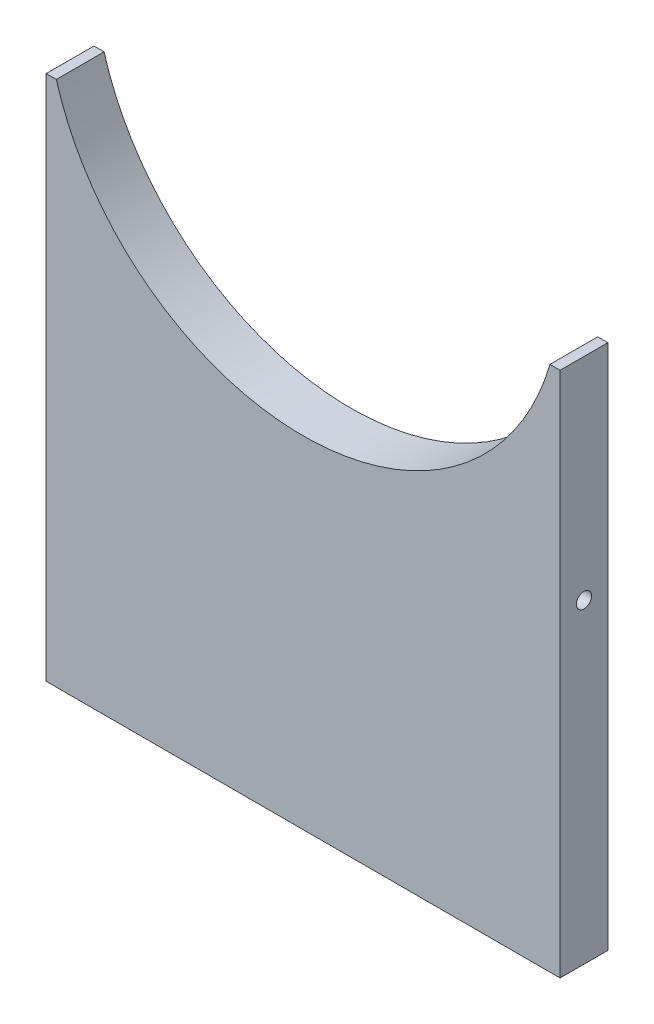
ISO-10303-21;
HEADER;
FILE_DESCRIPTION(('STEP AP214'),'2;1');
FILE_NAME('part.step','',(''),(''),'','','');
FILE_SCHEMA(('AUTOMOTIVE_DESIGN { 1 0 10303 214 1 1 1 1 }'));
ENDSEC;
DATA;
#1=APPLICATION_CONTEXT('core data for automotive mechanical design processes');
#2=APPLICATION_PROTOCOL_DEFINITION('international standard','automotive_design',2000,#1);
#3=PRODUCT_CONTEXT('',#1,'mechanical');
#4=PRODUCT('Part','Part','',(#3));
#5=PRODUCT_RELATED_PRODUCT_CATEGORY('part','',(#4));
#6=PRODUCT_DEFINITION_FORMATION('','',#4);
#7=PRODUCT_DEFINITION_CONTEXT('part definition',#1,'design');
#8=PRODUCT_DEFINITION('design','',#6,#7);
#9=PRODUCT_DEFINITION_SHAPE('','',#8);
#10=(LENGTH_UNIT() NAMED_UNIT(*) SI_UNIT(.MILLI.,.METRE.));
#11=(NAMED_UNIT(*) PLANE_ANGLE_UNIT() SI_UNIT($,.RADIAN.));
#12=(NAMED_UNIT(*) SI_UNIT($,.STERADIAN.) SOLID_ANGLE_UNIT());
#13=UNCERTAINTY_MEASURE_WITH_UNIT(LENGTH_MEASURE(1.E-05),#10,'distance_accuracy_value','');
#14=(GEOMETRIC_REPRESENTATION_CONTEXT(3) GLOBAL_UNCERTAINTY_ASSIGNED_CONTEXT((#13)) GLOBAL_UNIT_ASSIGNED_CONTEXT((#10,
#11,#12)) REPRESENTATION_CONTEXT('',''));
#15=CARTESIAN_POINT('',(0.,0.,0.));
#16=DIRECTION('',(0.,0.,1.));
#17=DIRECTION('',(1.,0.,0.));
#18=AXIS2_PLACEMENT_3D('',#15,#16,#17);
#19=CARTESIAN_POINT('',(0.,0.,12.7));
#20=DIRECTION('',(0.,1.,0.));
#21=DIRECTION('',(0.,0.,1.));
#22=AXIS2_PLACEMENT_3D('',#19,#20,#21);
#23=PLANE('',#22);
#24=CARTESIAN_POINT('',(112.35,0.,6.35));
#25=DIRECTION('',(0.,-1.,0.));
#26=DIRECTION('',(0.,0.,-1.));
#27=AXIS2_PLACEMENT_3D('',#24,#25,#26);
#28=CIRCLE('',#27,2.0193);
#29=CARTESIAN_POINT('',(112.35,0.,4.3307));
#30=VERTEX_POINT('',#29);
#31=EDGE_CURVE('E165',#30,#30,#28,.T.);
#32=ORIENTED_EDGE('',*,*,#31,.F.);
#33=EDGE_LOOP('',(#32));
#34=FACE_BOUND('',#33,.T.);
#35=CARTESIAN_POINT('',(24.35,0.,6.35));
#36=DIRECTION('',(0.,-1.,0.));
#37=DIRECTION('',(0.,0.,-1.));
#38=AXIS2_PLACEMENT_3D('',#35,#36,#37);
#39=CIRCLE('',#38,2.0193);
#40=CARTESIAN_POINT('',(24.35,0.,4.3307));
#41=VERTEX_POINT('',#40);
#42=EDGE_CURVE('E168',#41,#41,#39,.T.);
#43=ORIENTED_EDGE('',*,*,#42,.F.);
#44=EDGE_LOOP('',(#43));
#45=FACE_BOUND('',#44,.T.);
#46=DIRECTION('',(1.,0.,0.));
#47=VECTOR('',#46,1.);
#48=CARTESIAN_POINT('',(0.,0.,0.));
#49=LINE('',#48,#47);
#50=CARTESIAN_POINT('',(0.,0.,0.));
#51=VERTEX_POINT('',#50);
#52=CARTESIAN_POINT('',(136.7,0.,0.));
#53=VERTEX_POINT('',#52);
#54=EDGE_CURVE('E119',#51,#53,#49,.T.);
#55=ORIENTED_EDGE('',*,*,#54,.T.);
#56=DIRECTION('',(0.,0.,-1.));
#57=VECTOR('',#56,1.);
#58=CARTESIAN_POINT('',(136.7,0.,12.7));
#59=LINE('',#58,#57);
#60=CARTESIAN_POINT('',(136.7,0.,12.7));
#61=VERTEX_POINT('',#60);
#62=EDGE_CURVE('E11',#61,#53,#59,.T.);
#63=ORIENTED_EDGE('',*,*,#62,.F.);
#64=DIRECTION('',(1.,0.,0.));
#65=VECTOR('',#64,1.);
#66=CARTESIAN_POINT('',(0.,0.,12.7));
#67=LINE('',#66,#65);
#68=CARTESIAN_POINT('',(0.,0.,12.7));
#69=VERTEX_POINT('',#68);
#70=EDGE_CURVE('E130',#69,#61,#67,.T.);
#71=ORIENTED_EDGE('',*,*,#70,.F.);
#72=DIRECTION('',(0.,0.,-1.));
#73=VECTOR('',#72,1.);
#74=CARTESIAN_POINT('',(0.,0.,12.7));
#75=LINE('',#74,#73);
#76=EDGE_CURVE('E115',#69,#51,#75,.T.);
#77=ORIENTED_EDGE('',*,*,#76,.T.);
#78=EDGE_LOOP('',(#55,#63,#71,#77));
#79=FACE_BOUND('',#78,.T.);
#80=ADVANCED_FACE('F32',(#34,#45,#79),#23,.F.);
#81=CARTESIAN_POINT('',(136.7,0.,12.7));
#82=DIRECTION('',(-1.,0.,0.));
#83=DIRECTION('',(0.,0.,1.));
#84=AXIS2_PLACEMENT_3D('',#81,#82,#83);
#85=PLANE('',#84);
#86=CARTESIAN_POINT('',(136.7,83.866,6.34999999999999));
#87=DIRECTION('',(1.,0.,0.));
#88=DIRECTION('',(0.,0.,-1.));
#89=AXIS2_PLACEMENT_3D('',#86,#87,#88);
#90=CIRCLE('',#89,2.0193);
#91=CARTESIAN_POINT('',(136.7,83.866,4.33069999999999));
#92=VERTEX_POINT('',#91);
#93=EDGE_CURVE('E185',#92,#92,#90,.T.);
#94=ORIENTED_EDGE('',*,*,#93,.F.);
#95=EDGE_LOOP('',(#94));
#96=FACE_BOUND('',#95,.T.);
#97=DIRECTION('',(0.,1.,0.));
#98=VECTOR('',#97,1.);
#99=CARTESIAN_POINT('',(136.7,0.,0.));
#100=LINE('',#99,#98);
#101=CARTESIAN_POINT('',(136.7,140.,0.));
#102=VERTEX_POINT('',#101);
#103=EDGE_CURVE('E122',#53,#102,#100,.T.);
#104=ORIENTED_EDGE('',*,*,#103,.T.);
#105=DIRECTION('',(0.,0.,-1.));
#106=VECTOR('',#105,1.);
#107=CARTESIAN_POINT('',(136.7,140.,12.7));
#108=LINE('',#107,#106);
#109=CARTESIAN_POINT('',(136.7,140.,12.7));
#110=VERTEX_POINT('',#109);
#111=EDGE_CURVE('E40',#110,#102,#108,.T.);
#112=ORIENTED_EDGE('',*,*,#111,.F.);
#113=DIRECTION('',(0.,1.,0.));
#114=VECTOR('',#113,1.);
#115=CARTESIAN_POINT('',(136.7,0.,12.7));
#116=LINE('',#115,#114);
#117=EDGE_CURVE('E86',#61,#110,#116,.T.);
#118=ORIENTED_EDGE('',*,*,#117,.F.);
#119=ORIENTED_EDGE('',*,*,#62,.T.);
#120=EDGE_LOOP('',(#104,#112,#118,#119));
#121=FACE_BOUND('',#120,.T.);
#122=ADVANCED_FACE('F156',(#96,#121),#85,.F.);
#123=CARTESIAN_POINT('',(136.7,140.,12.7));
#124=DIRECTION('',(0.,-1.,0.));
#125=DIRECTION('',(0.,0.,-1.));
#126=AXIS2_PLACEMENT_3D('',#123,#124,#125);
#127=PLANE('',#126);
#128=DIRECTION('',(-1.,0.,0.));
#129=VECTOR('',#128,1.);
#130=CARTESIAN_POINT('',(136.7,140.,0.));
#131=LINE('',#130,#129);
#132=CARTESIAN_POINT('',(134.,140.,0.));
#133=VERTEX_POINT('',#132);
#134=EDGE_CURVE('E125',#102,#133,#131,.T.);
#135=ORIENTED_EDGE('',*,*,#134,.T.);
#136=DIRECTION('',(0.,0.,-1.));
#137=VECTOR('',#136,1.);
#138=CARTESIAN_POINT('',(134.,140.,12.7));
#139=LINE('',#138,#137);
#140=CARTESIAN_POINT('',(134.,140.,12.7));
#141=VERTEX_POINT('',#140);
#142=EDGE_CURVE('E110',#141,#133,#139,.T.);
#143=ORIENTED_EDGE('',*,*,#142,.F.);
#144=DIRECTION('',(-1.,0.,0.));
#145=VECTOR('',#144,1.);
#146=CARTESIAN_POINT('',(136.7,140.,12.7));
#147=LINE('',#146,#145);
#148=EDGE_CURVE('E101',#110,#141,#147,.T.);
#149=ORIENTED_EDGE('',*,*,#148,.F.);
#150=ORIENTED_EDGE('',*,*,#111,.T.);
#151=EDGE_LOOP('',(#135,#143,#149,#150));
#152=FACE_BOUND('',#151,.T.);
#153=ADVANCED_FACE('F136',(#152),#127,.F.);
#154=CARTESIAN_POINT('',(68.35,159.092783971391,12.7));
#155=DIRECTION('',(0.,0.,-1.));
#156=DIRECTION('',(-1.,0.,0.));
#157=AXIS2_PLACEMENT_3D('',#154,#155,#156);
#158=CYLINDRICAL_SURFACE('',#157,68.3699999983781);
#159=CARTESIAN_POINT('',(68.35,159.092783971391,0.));
#160=DIRECTION('',(0.,0.,-1.));
#161=DIRECTION('',(1.,0.,0.));
#162=AXIS2_PLACEMENT_3D('',#159,#160,#161);
#163=CIRCLE('',#162,68.3699999983781);
#164=CARTESIAN_POINT('',(2.70000000000005,140.,0.));
#165=VERTEX_POINT('',#164);
#166=EDGE_CURVE('E109',#133,#165,#163,.T.);
#167=ORIENTED_EDGE('',*,*,#166,.T.);
#168=DIRECTION('',(0.,0.,-1.));
#169=VECTOR('',#168,1.);
#170=CARTESIAN_POINT('',(2.70000000000005,140.,12.7));
#171=LINE('',#170,#169);
#172=CARTESIAN_POINT('',(2.70000000000005,140.,12.7));
#173=VERTEX_POINT('',#172);
#174=EDGE_CURVE('E106',#173,#165,#171,.T.);
#175=ORIENTED_EDGE('',*,*,#174,.F.);
#176=CARTESIAN_POINT('',(68.35,159.092783971391,12.7));
#177=DIRECTION('',(0.,0.,-1.));
#178=DIRECTION('',(1.,0.,0.));
#179=AXIS2_PLACEMENT_3D('',#176,#177,#178);
#180=CIRCLE('',#179,68.3699999983781);
#181=EDGE_CURVE('E95',#141,#173,#180,.T.);
#182=ORIENTED_EDGE('',*,*,#181,.F.);
#183=ORIENTED_EDGE('',*,*,#142,.T.);
#184=EDGE_LOOP('',(#167,#175,#182,#183));
#185=FACE_BOUND('',#184,.T.);
#186=ADVANCED_FACE('F107',(#185),#158,.F.);
#187=CARTESIAN_POINT('',(0.,140.,12.7));
#188=DIRECTION('',(0.,-1.,0.));
#189=DIRECTION('',(0.,0.,-1.));
#190=AXIS2_PLACEMENT_3D('',#187,#188,#189);
#191=PLANE('',#190);
#192=DIRECTION('',(-1.,0.,0.));
#193=VECTOR('',#192,1.);
#194=CARTESIAN_POINT('',(0.,140.,0.));
#195=LINE('',#194,#193);
#196=CARTESIAN_POINT('',(0.,140.,0.));
#197=VERTEX_POINT('',#196);
#198=EDGE_CURVE('E72',#165,#197,#195,.T.);
#199=ORIENTED_EDGE('',*,*,#198,.T.);
#200=DIRECTION('',(0.,0.,-1.));
#201=VECTOR('',#200,1.);
#202=CARTESIAN_POINT('',(0.,140.,12.7));
#203=LINE('',#202,#201);
#204=CARTESIAN_POINT('',(0.,140.,12.7));
#205=VERTEX_POINT('',#204);
#206=EDGE_CURVE('E111',#205,#197,#203,.T.);
#207=ORIENTED_EDGE('',*,*,#206,.F.);
#208=DIRECTION('',(-1.,0.,0.));
#209=VECTOR('',#208,1.);
#210=CARTESIAN_POINT('',(0.,140.,12.7));
#211=LINE('',#210,#209);
#212=EDGE_CURVE('E99',#173,#205,#211,.T.);
#213=ORIENTED_EDGE('',*,*,#212,.F.);
#214=ORIENTED_EDGE('',*,*,#174,.T.);
#215=EDGE_LOOP('',(#199,#207,#213,#214));
#216=FACE_BOUND('',#215,.T.);
#217=ADVANCED_FACE('F113',(#216),#191,.F.);
#218=CARTESIAN_POINT('',(0.,0.,12.7));
#219=DIRECTION('',(1.,0.,0.));
#220=DIRECTION('',(0.,0.,-1.));
#221=AXIS2_PLACEMENT_3D('',#218,#219,#220);
#222=PLANE('',#221);
#223=CARTESIAN_POINT('',(-3.05339327197747E-13,83.8659999999998,6.34999999999999));
#224=DIRECTION('',(-1.,0.,0.));
#225=DIRECTION('',(0.,0.,1.));
#226=AXIS2_PLACEMENT_3D('',#223,#224,#225);
#227=CIRCLE('',#226,2.0193);
#228=CARTESIAN_POINT('',(-3.05339327197747E-13,83.8659999999998,8.36929999999999));
#229=VERTEX_POINT('',#228);
#230=EDGE_CURVE('E174',#229,#229,#227,.T.);
#231=ORIENTED_EDGE('',*,*,#230,.F.);
#232=EDGE_LOOP('',(#231));
#233=FACE_BOUND('',#232,.T.);
#234=DIRECTION('',(0.,-1.,0.));
#235=VECTOR('',#234,1.);
#236=CARTESIAN_POINT('',(0.,0.,0.));
#237=LINE('',#236,#235);
#238=EDGE_CURVE('E78',#197,#51,#237,.T.);
#239=ORIENTED_EDGE('',*,*,#238,.T.);
#240=ORIENTED_EDGE('',*,*,#76,.F.);
#241=DIRECTION('',(0.,-1.,0.));
#242=VECTOR('',#241,1.);
#243=CARTESIAN_POINT('',(0.,0.,12.7));
#244=LINE('',#243,#242);
#245=EDGE_CURVE('E48',#205,#69,#244,.T.);
#246=ORIENTED_EDGE('',*,*,#245,.F.);
#247=ORIENTED_EDGE('',*,*,#206,.T.);
#248=EDGE_LOOP('',(#239,#240,#246,#247));
#249=FACE_BOUND('',#248,.T.);
#250=ADVANCED_FACE('F143',(#233,#249),#222,.F.);
#251=CARTESIAN_POINT('',(68.35,159.092783971391,12.7));
#252=DIRECTION('',(0.,0.,1.));
#253=DIRECTION('',(1.,0.,0.));
#254=AXIS2_PLACEMENT_3D('',#251,#252,#253);
#255=PLANE('',#254);
#256=ORIENTED_EDGE('',*,*,#70,.T.);
#257=ORIENTED_EDGE('',*,*,#117,.T.);
#258=ORIENTED_EDGE('',*,*,#148,.T.);
#259=ORIENTED_EDGE('',*,*,#181,.T.);
#260=ORIENTED_EDGE('',*,*,#212,.T.);
#261=ORIENTED_EDGE('',*,*,#245,.T.);
#262=EDGE_LOOP('',(#256,#257,#258,#259,#260,#261));
#263=FACE_BOUND('',#262,.T.);
#264=ADVANCED_FACE('F97',(#263),#255,.T.);
#265=CARTESIAN_POINT('',(68.35,159.092783971391,0.));
#266=DIRECTION('',(0.,0.,1.));
#267=DIRECTION('',(1.,0.,0.));
#268=AXIS2_PLACEMENT_3D('',#265,#266,#267);
#269=PLANE('',#268);
#270=ORIENTED_EDGE('',*,*,#54,.F.);
#271=ORIENTED_EDGE('',*,*,#238,.F.);
#272=ORIENTED_EDGE('',*,*,#198,.F.);
#273=ORIENTED_EDGE('',*,*,#166,.F.);
#274=ORIENTED_EDGE('',*,*,#134,.F.);
#275=ORIENTED_EDGE('',*,*,#103,.F.);
#276=EDGE_LOOP('',(#270,#271,#272,#273,#274,#275));
#277=FACE_BOUND('',#276,.T.);
#278=ADVANCED_FACE('F139',(#277),#269,.F.);
#279=CARTESIAN_POINT('',(111.3,83.866,6.34999999999999));
#280=DIRECTION('',(1.,0.,0.));
#281=DIRECTION('',(0.,0.,-1.));
#282=AXIS2_PLACEMENT_3D('',#279,#280,#281);
#283=CONICAL_SURFACE('',#282,2.01929999999999,1.02974425867665);
#284=CARTESIAN_POINT('',(110.086682151998,83.866,6.34999999999999));
#285=VERTEX_POINT('',#284);
#286=VERTEX_LOOP('',#285);
#287=FACE_BOUND('',#286,.T.);
#288=CARTESIAN_POINT('',(111.3,83.866,6.34999999999999));
#289=DIRECTION('',(1.,0.,0.));
#290=DIRECTION('',(0.,0.,-1.));
#291=AXIS2_PLACEMENT_3D('',#288,#289,#290);
#292=CIRCLE('',#291,2.01929999999999);
#293=CARTESIAN_POINT('',(111.3,83.866,4.3307));
#294=VERTEX_POINT('',#293);
#295=EDGE_CURVE('E123',#294,#294,#292,.T.);
#296=ORIENTED_EDGE('',*,*,#295,.T.);
#297=EDGE_LOOP('',(#296));
#298=FACE_BOUND('',#297,.T.);
#299=ADVANCED_FACE('F193',(#287,#298),#283,.F.);
#300=CARTESIAN_POINT('',(136.7,83.866,6.34999999999999));
#301=DIRECTION('',(1.,0.,0.));
#302=DIRECTION('',(0.,0.,-1.));
#303=AXIS2_PLACEMENT_3D('',#300,#301,#302);
#304=CYLINDRICAL_SURFACE('',#303,2.01929999999999);
#305=ORIENTED_EDGE('',*,*,#295,.F.);
#306=EDGE_LOOP('',(#305));
#307=FACE_BOUND('',#306,.T.);
#308=ORIENTED_EDGE('',*,*,#93,.T.);
#309=EDGE_LOOP('',(#308));
#310=FACE_BOUND('',#309,.T.);
#311=ADVANCED_FACE('F195',(#307,#310),#304,.F.);
#312=CARTESIAN_POINT('',(25.3999999999997,83.8659999999998,6.34999999999999));
#313=DIRECTION('',(-1.,0.,0.));
#314=DIRECTION('',(0.,0.,1.));
#315=AXIS2_PLACEMENT_3D('',#312,#313,#314);
#316=CONICAL_SURFACE('',#315,2.01929999999999,1.02974425867665);
#317=CARTESIAN_POINT('',(26.6133178480021,83.8659999999998,6.34999999999999));
#318=VERTEX_POINT('',#317);
#319=VERTEX_LOOP('',#318);
#320=FACE_BOUND('',#319,.T.);
#321=CARTESIAN_POINT('',(25.3999999999997,83.8659999999998,6.34999999999999));
#322=DIRECTION('',(-1.,0.,0.));
#323=DIRECTION('',(0.,0.,1.));
#324=AXIS2_PLACEMENT_3D('',#321,#322,#323);
#325=CIRCLE('',#324,2.01929999999999);
#326=CARTESIAN_POINT('',(25.3999999999997,83.8659999999998,8.36929999999998));
#327=VERTEX_POINT('',#326);
#328=EDGE_CURVE('E182',#327,#327,#325,.T.);
#329=ORIENTED_EDGE('',*,*,#328,.T.);
#330=EDGE_LOOP('',(#329));
#331=FACE_BOUND('',#330,.T.);
#332=ADVANCED_FACE('F198',(#320,#331),#316,.F.);
#333=CARTESIAN_POINT('',(-3.05311331771918E-13,83.8659999999998,6.34999999999999));
#334=DIRECTION('',(-1.,0.,0.));
#335=DIRECTION('',(0.,0.,1.));
#336=AXIS2_PLACEMENT_3D('',#333,#334,#335);
#337=CYLINDRICAL_SURFACE('',#336,2.01929999999999);
#338=ORIENTED_EDGE('',*,*,#328,.F.);
#339=EDGE_LOOP('',(#338));
#340=FACE_BOUND('',#339,.T.);
#341=ORIENTED_EDGE('',*,*,#230,.T.);
#342=EDGE_LOOP('',(#341));
#343=FACE_BOUND('',#342,.T.);
#344=ADVANCED_FACE('F205',(#340,#343),#337,.F.);
#345=CARTESIAN_POINT('',(24.35,25.4,6.35));
#346=DIRECTION('',(0.,-1.,0.));
#347=DIRECTION('',(0.,0.,-1.));
#348=AXIS2_PLACEMENT_3D('',#345,#346,#347);
#349=CONICAL_SURFACE('',#348,2.01929999999999,1.02974425867665);
#350=CARTESIAN_POINT('',(24.35,26.6133178480024,6.35));
#351=VERTEX_POINT('',#350);
#352=VERTEX_LOOP('',#351);
#353=FACE_BOUND('',#352,.T.);
#354=CARTESIAN_POINT('',(24.35,25.4,6.35));
#355=DIRECTION('',(0.,-1.,0.));
#356=DIRECTION('',(0.,0.,-1.));
#357=AXIS2_PLACEMENT_3D('',#354,#355,#356);
#358=CIRCLE('',#357,2.01929999999999);
#359=CARTESIAN_POINT('',(24.35,25.4,4.3307));
#360=VERTEX_POINT('',#359);
#361=EDGE_CURVE('E170',#360,#360,#358,.T.);
#362=ORIENTED_EDGE('',*,*,#361,.T.);
#363=EDGE_LOOP('',(#362));
#364=FACE_BOUND('',#363,.T.);
#365=ADVANCED_FACE('F247',(#353,#364),#349,.F.);
#366=CARTESIAN_POINT('',(24.35,0.,6.35));
#367=DIRECTION('',(0.,-1.,0.));
#368=DIRECTION('',(0.,0.,-1.));
#369=AXIS2_PLACEMENT_3D('',#366,#367,#368);
#370=CYLINDRICAL_SURFACE('',#369,2.0193);
#371=ORIENTED_EDGE('',*,*,#361,.F.);
#372=EDGE_LOOP('',(#371));
#373=FACE_BOUND('',#372,.T.);
#374=ORIENTED_EDGE('',*,*,#42,.T.);
#375=EDGE_LOOP('',(#374));
#376=FACE_BOUND('',#375,.T.);
#377=ADVANCED_FACE('F261',(#373,#376),#370,.F.);
#378=CARTESIAN_POINT('',(112.35,25.4,6.35));
#379=DIRECTION('',(0.,-1.,0.));
#380=DIRECTION('',(0.,0.,-1.));
#381=AXIS2_PLACEMENT_3D('',#378,#379,#380);
#382=CONICAL_SURFACE('',#381,2.01929999999999,1.02974425867665);
#383=CARTESIAN_POINT('',(112.35,26.6133178480024,6.35));
#384=VERTEX_POINT('',#383);
#385=VERTEX_LOOP('',#384);
#386=FACE_BOUND('',#385,.T.);
#387=CARTESIAN_POINT('',(112.35,25.4,6.35));
#388=DIRECTION('',(0.,-1.,0.));
#389=DIRECTION('',(0.,0.,-1.));
#390=AXIS2_PLACEMENT_3D('',#387,#388,#389);
#391=CIRCLE('',#390,2.01929999999999);
#392=CARTESIAN_POINT('',(112.35,25.4,4.33070000000001));
#393=VERTEX_POINT('',#392);
#394=EDGE_CURVE('E171',#393,#393,#391,.T.);
#395=ORIENTED_EDGE('',*,*,#394,.T.);
#396=EDGE_LOOP('',(#395));
#397=FACE_BOUND('',#396,.T.);
#398=ADVANCED_FACE('F271',(#386,#397),#382,.F.);
#399=CARTESIAN_POINT('',(112.35,0.,6.35));
#400=DIRECTION('',(0.,-1.,0.));
#401=DIRECTION('',(0.,0.,-1.));
#402=AXIS2_PLACEMENT_3D('',#399,#400,#401);
#403=CYLINDRICAL_SURFACE('',#402,2.01929999999999);
#404=ORIENTED_EDGE('',*,*,#394,.F.);
#405=EDGE_LOOP('',(#404));
#406=FACE_BOUND('',#405,.T.);
#407=ORIENTED_EDGE('',*,*,#31,.T.);
#408=EDGE_LOOP('',(#407));
#409=FACE_BOUND('',#408,.T.);
#410=ADVANCED_FACE('F281',(#406,#409),#403,.F.);
#411=CLOSED_SHELL('',(#80,#122,#153,#186,#217,#250,#264,#278,#299,#311,#332,#344,#365,#377,#398,#410));
#412=MANIFOLD_SOLID_BREP('B2',#411);
#413=ADVANCED_BREP_SHAPE_REPRESENTATION('',(#18,#412),#14);
#414=SHAPE_DEFINITION_REPRESENTATION(#9,#413);
ENDSEC;
END-ISO-10303-21;
